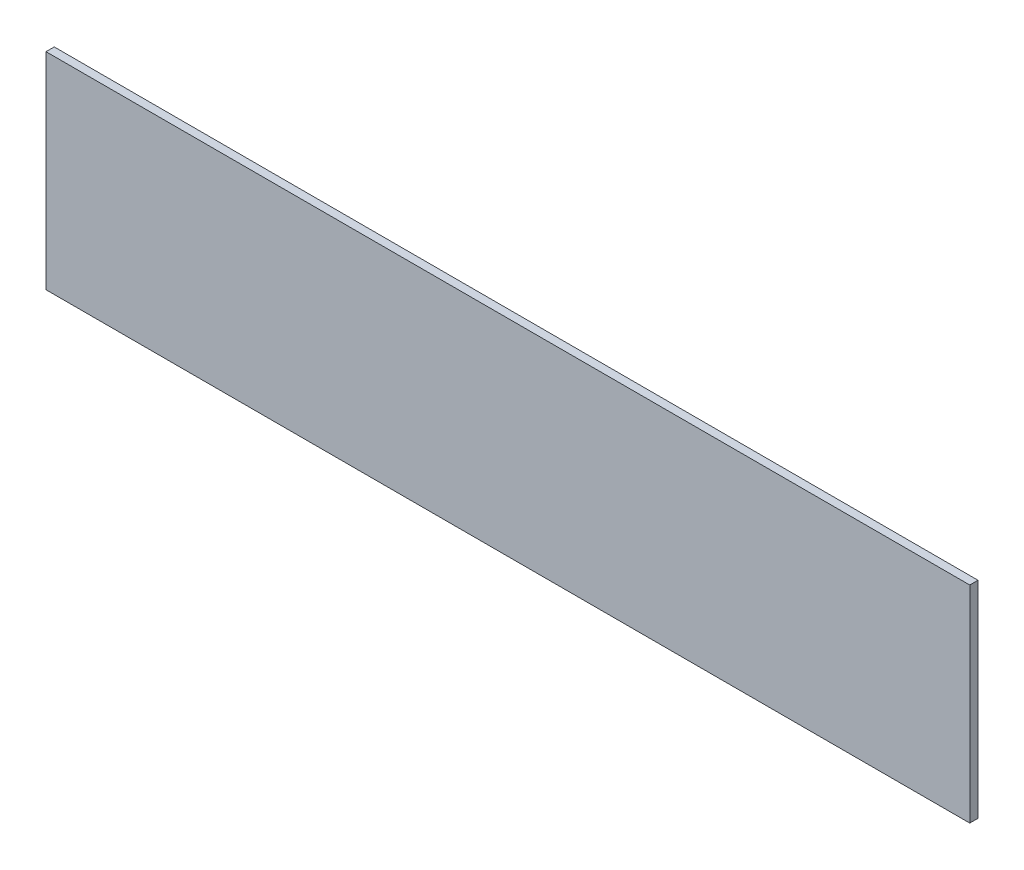
ISO-10303-21;
HEADER;
FILE_DESCRIPTION(('STEP AP214'),'2;1');
FILE_NAME('part.step','',(''),(''),'','','');
FILE_SCHEMA(('AUTOMOTIVE_DESIGN { 1 0 10303 214 1 1 1 1 }'));
ENDSEC;
DATA;
#1=APPLICATION_CONTEXT('core data for automotive mechanical design processes');
#2=APPLICATION_PROTOCOL_DEFINITION('international standard','automotive_design',2000,#1);
#3=PRODUCT_CONTEXT('',#1,'mechanical');
#4=PRODUCT('Part','Part','',(#3));
#5=PRODUCT_RELATED_PRODUCT_CATEGORY('part','',(#4));
#6=PRODUCT_DEFINITION_FORMATION('','',#4);
#7=PRODUCT_DEFINITION_CONTEXT('part definition',#1,'design');
#8=PRODUCT_DEFINITION('design','',#6,#7);
#9=PRODUCT_DEFINITION_SHAPE('','',#8);
#10=(LENGTH_UNIT() NAMED_UNIT(*) SI_UNIT(.MILLI.,.METRE.));
#11=(NAMED_UNIT(*) PLANE_ANGLE_UNIT() SI_UNIT($,.RADIAN.));
#12=(NAMED_UNIT(*) SI_UNIT($,.STERADIAN.) SOLID_ANGLE_UNIT());
#13=UNCERTAINTY_MEASURE_WITH_UNIT(LENGTH_MEASURE(1.E-05),#10,'distance_accuracy_value','');
#14=(GEOMETRIC_REPRESENTATION_CONTEXT(3) GLOBAL_UNCERTAINTY_ASSIGNED_CONTEXT((#13)) GLOBAL_UNIT_ASSIGNED_CONTEXT((#10,
#11,#12)) REPRESENTATION_CONTEXT('',''));
#15=CARTESIAN_POINT('',(0.,0.,0.));
#16=DIRECTION('',(0.,0.,1.));
#17=DIRECTION('',(1.,0.,0.));
#18=AXIS2_PLACEMENT_3D('',#15,#16,#17);
#19=CARTESIAN_POINT('',(112.,25.,1.));
#20=DIRECTION('',(-1.,0.,0.));
#21=DIRECTION('',(0.,-1.,0.));
#22=AXIS2_PLACEMENT_3D('',#19,#20,#21);
#23=PLANE('',#22);
#24=DIRECTION('',(0.,1.,0.));
#25=VECTOR('',#24,1.);
#26=CARTESIAN_POINT('',(112.,25.,-1.));
#27=LINE('',#26,#25);
#28=CARTESIAN_POINT('',(112.,-25.,-1.));
#29=VERTEX_POINT('',#28);
#30=CARTESIAN_POINT('',(112.,25.,-1.));
#31=VERTEX_POINT('',#30);
#32=EDGE_CURVE('E111',#29,#31,#27,.T.);
#33=ORIENTED_EDGE('',*,*,#32,.T.);
#34=DIRECTION('',(0.,0.,-1.));
#35=VECTOR('',#34,1.);
#36=CARTESIAN_POINT('',(112.,25.,1.));
#37=LINE('',#36,#35);
#38=CARTESIAN_POINT('',(112.,25.,1.));
#39=VERTEX_POINT('',#38);
#40=EDGE_CURVE('E11',#39,#31,#37,.T.);
#41=ORIENTED_EDGE('',*,*,#40,.F.);
#42=DIRECTION('',(0.,1.,0.));
#43=VECTOR('',#42,1.);
#44=CARTESIAN_POINT('',(112.,25.,1.));
#45=LINE('',#44,#43);
#46=CARTESIAN_POINT('',(112.,-25.,1.));
#47=VERTEX_POINT('',#46);
#48=EDGE_CURVE('E95',#47,#39,#45,.T.);
#49=ORIENTED_EDGE('',*,*,#48,.F.);
#50=DIRECTION('',(0.,0.,-1.));
#51=VECTOR('',#50,1.);
#52=CARTESIAN_POINT('',(112.,-25.,1.));
#53=LINE('',#52,#51);
#54=EDGE_CURVE('E107',#47,#29,#53,.T.);
#55=ORIENTED_EDGE('',*,*,#54,.T.);
#56=EDGE_LOOP('',(#33,#41,#49,#55));
#57=FACE_BOUND('',#56,.T.);
#58=ADVANCED_FACE('F43',(#57),#23,.F.);
#59=CARTESIAN_POINT('',(-112.,25.,1.));
#60=DIRECTION('',(0.,-1.,0.));
#61=DIRECTION('',(0.,0.,-1.));
#62=AXIS2_PLACEMENT_3D('',#59,#60,#61);
#63=PLANE('',#62);
#64=DIRECTION('',(-1.,0.,0.));
#65=VECTOR('',#64,1.);
#66=CARTESIAN_POINT('',(-112.,25.,-1.));
#67=LINE('',#66,#65);
#68=CARTESIAN_POINT('',(-112.,25.,-1.));
#69=VERTEX_POINT('',#68);
#70=EDGE_CURVE('E100',#31,#69,#67,.T.);
#71=ORIENTED_EDGE('',*,*,#70,.T.);
#72=DIRECTION('',(0.,0.,-1.));
#73=VECTOR('',#72,1.);
#74=CARTESIAN_POINT('',(-112.,25.,1.));
#75=LINE('',#74,#73);
#76=CARTESIAN_POINT('',(-112.,25.,1.));
#77=VERTEX_POINT('',#76);
#78=EDGE_CURVE('E52',#77,#69,#75,.T.);
#79=ORIENTED_EDGE('',*,*,#78,.F.);
#80=DIRECTION('',(-1.,0.,0.));
#81=VECTOR('',#80,1.);
#82=CARTESIAN_POINT('',(-112.,25.,1.));
#83=LINE('',#82,#81);
#84=EDGE_CURVE('E90',#39,#77,#83,.T.);
#85=ORIENTED_EDGE('',*,*,#84,.F.);
#86=ORIENTED_EDGE('',*,*,#40,.T.);
#87=EDGE_LOOP('',(#71,#79,#85,#86));
#88=FACE_BOUND('',#87,.T.);
#89=ADVANCED_FACE('F99',(#88),#63,.F.);
#90=CARTESIAN_POINT('',(-112.,25.,1.));
#91=DIRECTION('',(1.,0.,0.));
#92=DIRECTION('',(0.,1.,0.));
#93=AXIS2_PLACEMENT_3D('',#90,#91,#92);
#94=PLANE('',#93);
#95=DIRECTION('',(0.,-1.,0.));
#96=VECTOR('',#95,1.);
#97=CARTESIAN_POINT('',(-112.,25.,-1.));
#98=LINE('',#97,#96);
#99=CARTESIAN_POINT('',(-112.,-25.,-1.));
#100=VERTEX_POINT('',#99);
#101=EDGE_CURVE('E77',#69,#100,#98,.T.);
#102=ORIENTED_EDGE('',*,*,#101,.T.);
#103=DIRECTION('',(0.,0.,-1.));
#104=VECTOR('',#103,1.);
#105=CARTESIAN_POINT('',(-112.,-25.,1.));
#106=LINE('',#105,#104);
#107=CARTESIAN_POINT('',(-112.,-25.,1.));
#108=VERTEX_POINT('',#107);
#109=EDGE_CURVE('E102',#108,#100,#106,.T.);
#110=ORIENTED_EDGE('',*,*,#109,.F.);
#111=DIRECTION('',(0.,-1.,0.));
#112=VECTOR('',#111,1.);
#113=CARTESIAN_POINT('',(-112.,25.,1.));
#114=LINE('',#113,#112);
#115=EDGE_CURVE('E93',#77,#108,#114,.T.);
#116=ORIENTED_EDGE('',*,*,#115,.F.);
#117=ORIENTED_EDGE('',*,*,#78,.T.);
#118=EDGE_LOOP('',(#102,#110,#116,#117));
#119=FACE_BOUND('',#118,.T.);
#120=ADVANCED_FACE('F103',(#119),#94,.F.);
#121=CARTESIAN_POINT('',(-112.,-25.,1.));
#122=DIRECTION('',(0.,1.,0.));
#123=DIRECTION('',(0.,0.,1.));
#124=AXIS2_PLACEMENT_3D('',#121,#122,#123);
#125=PLANE('',#124);
#126=DIRECTION('',(1.,0.,0.));
#127=VECTOR('',#126,1.);
#128=CARTESIAN_POINT('',(-112.,-25.,-1.));
#129=LINE('',#128,#127);
#130=EDGE_CURVE('E83',#100,#29,#129,.T.);
#131=ORIENTED_EDGE('',*,*,#130,.T.);
#132=ORIENTED_EDGE('',*,*,#54,.F.);
#133=DIRECTION('',(1.,0.,0.));
#134=VECTOR('',#133,1.);
#135=CARTESIAN_POINT('',(-112.,-25.,1.));
#136=LINE('',#135,#134);
#137=EDGE_CURVE('E60',#108,#47,#136,.T.);
#138=ORIENTED_EDGE('',*,*,#137,.F.);
#139=ORIENTED_EDGE('',*,*,#109,.T.);
#140=EDGE_LOOP('',(#131,#132,#138,#139));
#141=FACE_BOUND('',#140,.T.);
#142=ADVANCED_FACE('F124',(#141),#125,.F.);
#143=CARTESIAN_POINT('',(0.,0.,1.));
#144=DIRECTION('',(0.,0.,1.));
#145=DIRECTION('',(1.,0.,0.));
#146=AXIS2_PLACEMENT_3D('',#143,#144,#145);
#147=PLANE('',#146);
#148=ORIENTED_EDGE('',*,*,#48,.T.);
#149=ORIENTED_EDGE('',*,*,#84,.T.);
#150=ORIENTED_EDGE('',*,*,#115,.T.);
#151=ORIENTED_EDGE('',*,*,#137,.T.);
#152=EDGE_LOOP('',(#148,#149,#150,#151));
#153=FACE_BOUND('',#152,.T.);
#154=ADVANCED_FACE('F91',(#153),#147,.T.);
#155=CARTESIAN_POINT('',(0.,0.,-1.));
#156=DIRECTION('',(0.,0.,1.));
#157=DIRECTION('',(1.,0.,0.));
#158=AXIS2_PLACEMENT_3D('',#155,#156,#157);
#159=PLANE('',#158);
#160=ORIENTED_EDGE('',*,*,#32,.F.);
#161=ORIENTED_EDGE('',*,*,#130,.F.);
#162=ORIENTED_EDGE('',*,*,#101,.F.);
#163=ORIENTED_EDGE('',*,*,#70,.F.);
#164=EDGE_LOOP('',(#160,#161,#162,#163));
#165=FACE_BOUND('',#164,.T.);
#166=ADVANCED_FACE('F127',(#165),#159,.F.);
#167=CLOSED_SHELL('',(#58,#89,#120,#142,#154,#166));
#168=MANIFOLD_SOLID_BREP('B2',#167);
#169=ADVANCED_BREP_SHAPE_REPRESENTATION('',(#18,#168),#14);
#170=SHAPE_DEFINITION_REPRESENTATION(#9,#169);
ENDSEC;
END-ISO-10303-21;
